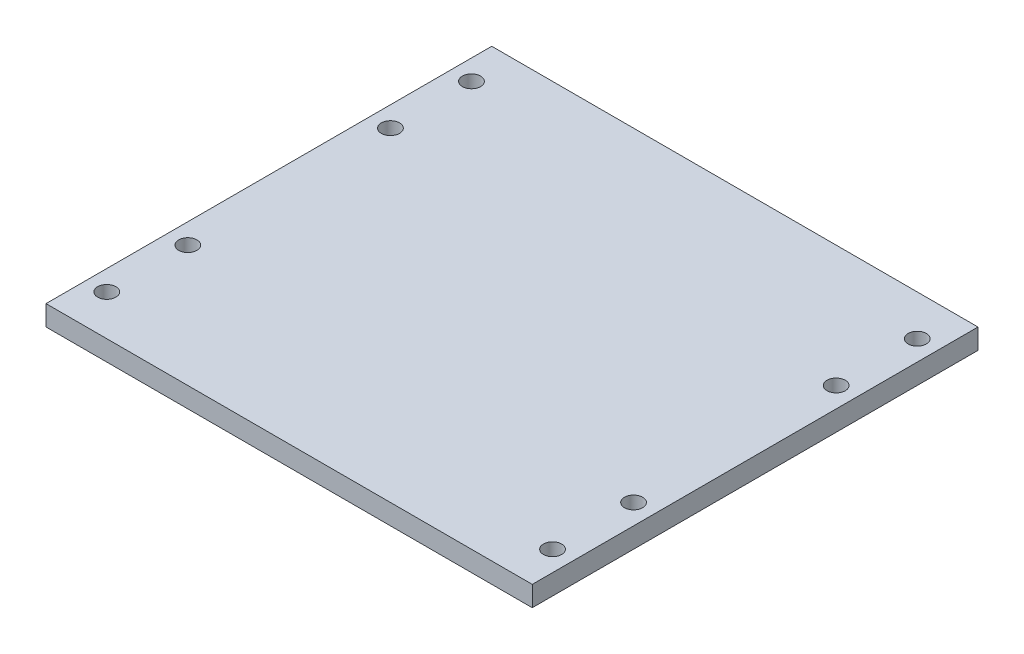
ISO-10303-21;
HEADER;
FILE_DESCRIPTION(('STEP AP214'),'2;1');
FILE_NAME('part.step','',(''),(''),'','','');
FILE_SCHEMA(('AUTOMOTIVE_DESIGN { 1 0 10303 214 1 1 1 1 }'));
ENDSEC;
DATA;
#1=APPLICATION_CONTEXT('core data for automotive mechanical design processes');
#2=APPLICATION_PROTOCOL_DEFINITION('international standard','automotive_design',2000,#1);
#3=PRODUCT_CONTEXT('',#1,'mechanical');
#4=PRODUCT('Part','Part','',(#3));
#5=PRODUCT_RELATED_PRODUCT_CATEGORY('part','',(#4));
#6=PRODUCT_DEFINITION_FORMATION('','',#4);
#7=PRODUCT_DEFINITION_CONTEXT('part definition',#1,'design');
#8=PRODUCT_DEFINITION('design','',#6,#7);
#9=PRODUCT_DEFINITION_SHAPE('','',#8);
#10=(LENGTH_UNIT() NAMED_UNIT(*) SI_UNIT(.MILLI.,.METRE.));
#11=(NAMED_UNIT(*) PLANE_ANGLE_UNIT() SI_UNIT($,.RADIAN.));
#12=(NAMED_UNIT(*) SI_UNIT($,.STERADIAN.) SOLID_ANGLE_UNIT());
#13=UNCERTAINTY_MEASURE_WITH_UNIT(LENGTH_MEASURE(1.E-05),#10,'distance_accuracy_value','');
#14=(GEOMETRIC_REPRESENTATION_CONTEXT(3) GLOBAL_UNCERTAINTY_ASSIGNED_CONTEXT((#13)) GLOBAL_UNIT_ASSIGNED_CONTEXT((#10,
#11,#12)) REPRESENTATION_CONTEXT('',''));
#15=CARTESIAN_POINT('',(0.,0.,0.));
#16=DIRECTION('',(0.,0.,1.));
#17=DIRECTION('',(1.,0.,0.));
#18=AXIS2_PLACEMENT_3D('',#15,#16,#17);
#19=CARTESIAN_POINT('',(-60.,5.,-55.));
#20=DIRECTION('',(1.,0.,0.));
#21=DIRECTION('',(0.,0.,-1.));
#22=AXIS2_PLACEMENT_3D('',#19,#20,#21);
#23=PLANE('',#22);
#24=DIRECTION('',(0.,0.,1.));
#25=VECTOR('',#24,1.);
#26=CARTESIAN_POINT('',(-60.,0.,-55.));
#27=LINE('',#26,#25);
#28=CARTESIAN_POINT('',(-60.,0.,-55.));
#29=VERTEX_POINT('',#28);
#30=CARTESIAN_POINT('',(-60.,0.,55.));
#31=VERTEX_POINT('',#30);
#32=EDGE_CURVE('E122',#29,#31,#27,.T.);
#33=ORIENTED_EDGE('',*,*,#32,.T.);
#34=DIRECTION('',(0.,-1.,0.));
#35=VECTOR('',#34,1.);
#36=CARTESIAN_POINT('',(-60.,5.,55.));
#37=LINE('',#36,#35);
#38=CARTESIAN_POINT('',(-60.,5.,55.));
#39=VERTEX_POINT('',#38);
#40=EDGE_CURVE('E11',#39,#31,#37,.T.);
#41=ORIENTED_EDGE('',*,*,#40,.F.);
#42=DIRECTION('',(0.,0.,1.));
#43=VECTOR('',#42,1.);
#44=CARTESIAN_POINT('',(-60.,5.,-55.));
#45=LINE('',#44,#43);
#46=CARTESIAN_POINT('',(-60.,5.,-55.));
#47=VERTEX_POINT('',#46);
#48=EDGE_CURVE('E103',#47,#39,#45,.T.);
#49=ORIENTED_EDGE('',*,*,#48,.F.);
#50=DIRECTION('',(0.,-1.,0.));
#51=VECTOR('',#50,1.);
#52=CARTESIAN_POINT('',(-60.,5.,-55.));
#53=LINE('',#52,#51);
#54=EDGE_CURVE('E118',#47,#29,#53,.T.);
#55=ORIENTED_EDGE('',*,*,#54,.T.);
#56=EDGE_LOOP('',(#33,#41,#49,#55));
#57=FACE_BOUND('',#56,.T.);
#58=ADVANCED_FACE('F47',(#57),#23,.F.);
#59=CARTESIAN_POINT('',(-60.,5.,55.));
#60=DIRECTION('',(0.,0.,-1.));
#61=DIRECTION('',(-1.,0.,0.));
#62=AXIS2_PLACEMENT_3D('',#59,#60,#61);
#63=PLANE('',#62);
#64=DIRECTION('',(1.,0.,0.));
#65=VECTOR('',#64,1.);
#66=CARTESIAN_POINT('',(-60.,0.,55.));
#67=LINE('',#66,#65);
#68=CARTESIAN_POINT('',(60.,0.,55.));
#69=VERTEX_POINT('',#68);
#70=EDGE_CURVE('E108',#31,#69,#67,.T.);
#71=ORIENTED_EDGE('',*,*,#70,.T.);
#72=DIRECTION('',(0.,-1.,0.));
#73=VECTOR('',#72,1.);
#74=CARTESIAN_POINT('',(60.,5.,55.));
#75=LINE('',#74,#73);
#76=CARTESIAN_POINT('',(60.,5.,55.));
#77=VERTEX_POINT('',#76);
#78=EDGE_CURVE('E56',#77,#69,#75,.T.);
#79=ORIENTED_EDGE('',*,*,#78,.F.);
#80=DIRECTION('',(1.,0.,0.));
#81=VECTOR('',#80,1.);
#82=CARTESIAN_POINT('',(-60.,5.,55.));
#83=LINE('',#82,#81);
#84=EDGE_CURVE('E98',#39,#77,#83,.T.);
#85=ORIENTED_EDGE('',*,*,#84,.F.);
#86=ORIENTED_EDGE('',*,*,#40,.T.);
#87=EDGE_LOOP('',(#71,#79,#85,#86));
#88=FACE_BOUND('',#87,.T.);
#89=ADVANCED_FACE('F107',(#88),#63,.F.);
#90=CARTESIAN_POINT('',(60.,5.,-55.));
#91=DIRECTION('',(-1.,0.,0.));
#92=DIRECTION('',(0.,0.,1.));
#93=AXIS2_PLACEMENT_3D('',#90,#91,#92);
#94=PLANE('',#93);
#95=DIRECTION('',(0.,0.,-1.));
#96=VECTOR('',#95,1.);
#97=CARTESIAN_POINT('',(60.,0.,-55.));
#98=LINE('',#97,#96);
#99=CARTESIAN_POINT('',(60.,0.,-55.));
#100=VERTEX_POINT('',#99);
#101=EDGE_CURVE('E85',#69,#100,#98,.T.);
#102=ORIENTED_EDGE('',*,*,#101,.T.);
#103=DIRECTION('',(0.,-1.,0.));
#104=VECTOR('',#103,1.);
#105=CARTESIAN_POINT('',(60.,5.,-55.));
#106=LINE('',#105,#104);
#107=CARTESIAN_POINT('',(60.,5.,-55.));
#108=VERTEX_POINT('',#107);
#109=EDGE_CURVE('E110',#108,#100,#106,.T.);
#110=ORIENTED_EDGE('',*,*,#109,.F.);
#111=DIRECTION('',(0.,0.,-1.));
#112=VECTOR('',#111,1.);
#113=CARTESIAN_POINT('',(60.,5.,-55.));
#114=LINE('',#113,#112);
#115=EDGE_CURVE('E101',#77,#108,#114,.T.);
#116=ORIENTED_EDGE('',*,*,#115,.F.);
#117=ORIENTED_EDGE('',*,*,#78,.T.);
#118=EDGE_LOOP('',(#102,#110,#116,#117));
#119=FACE_BOUND('',#118,.T.);
#120=ADVANCED_FACE('F111',(#119),#94,.F.);
#121=CARTESIAN_POINT('',(-60.,5.,-55.));
#122=DIRECTION('',(0.,0.,1.));
#123=DIRECTION('',(1.,0.,0.));
#124=AXIS2_PLACEMENT_3D('',#121,#122,#123);
#125=PLANE('',#124);
#126=DIRECTION('',(-1.,0.,0.));
#127=VECTOR('',#126,1.);
#128=CARTESIAN_POINT('',(-60.,0.,-55.));
#129=LINE('',#128,#127);
#130=EDGE_CURVE('E91',#100,#29,#129,.T.);
#131=ORIENTED_EDGE('',*,*,#130,.T.);
#132=ORIENTED_EDGE('',*,*,#54,.F.);
#133=DIRECTION('',(-1.,0.,0.));
#134=VECTOR('',#133,1.);
#135=CARTESIAN_POINT('',(-60.,5.,-55.));
#136=LINE('',#135,#134);
#137=EDGE_CURVE('E67',#108,#47,#136,.T.);
#138=ORIENTED_EDGE('',*,*,#137,.F.);
#139=ORIENTED_EDGE('',*,*,#109,.T.);
#140=EDGE_LOOP('',(#131,#132,#138,#139));
#141=FACE_BOUND('',#140,.T.);
#142=ADVANCED_FACE('F139',(#141),#125,.F.);
#143=CARTESIAN_POINT('',(0.,5.,0.));
#144=DIRECTION('',(0.,1.,0.));
#145=DIRECTION('',(0.,0.,1.));
#146=AXIS2_PLACEMENT_3D('',#143,#144,#145);
#147=PLANE('',#146);
#148=CARTESIAN_POINT('',(-55.,5.,-45.));
#149=DIRECTION('',(0.,1.,0.));
#150=DIRECTION('',(0.,0.,1.));
#151=AXIS2_PLACEMENT_3D('',#148,#149,#150);
#152=CIRCLE('',#151,2.25);
#153=CARTESIAN_POINT('',(-55.,5.,-42.75));
#154=VERTEX_POINT('',#153);
#155=EDGE_CURVE('E203',#154,#154,#152,.T.);
#156=ORIENTED_EDGE('',*,*,#155,.F.);
#157=EDGE_LOOP('',(#156));
#158=FACE_BOUND('',#157,.T.);
#159=CARTESIAN_POINT('',(-55.,5.,-25.));
#160=DIRECTION('',(0.,1.,0.));
#161=DIRECTION('',(0.,0.,1.));
#162=AXIS2_PLACEMENT_3D('',#159,#160,#161);
#163=CIRCLE('',#162,2.25);
#164=CARTESIAN_POINT('',(-55.,5.,-22.75));
#165=VERTEX_POINT('',#164);
#166=EDGE_CURVE('E195',#165,#165,#163,.T.);
#167=ORIENTED_EDGE('',*,*,#166,.F.);
#168=EDGE_LOOP('',(#167));
#169=FACE_BOUND('',#168,.T.);
#170=CARTESIAN_POINT('',(-55.,5.,25.));
#171=DIRECTION('',(0.,1.,0.));
#172=DIRECTION('',(0.,0.,1.));
#173=AXIS2_PLACEMENT_3D('',#170,#171,#172);
#174=CIRCLE('',#173,2.25);
#175=CARTESIAN_POINT('',(-55.,5.,27.25));
#176=VERTEX_POINT('',#175);
#177=EDGE_CURVE('E187',#176,#176,#174,.T.);
#178=ORIENTED_EDGE('',*,*,#177,.F.);
#179=EDGE_LOOP('',(#178));
#180=FACE_BOUND('',#179,.T.);
#181=CARTESIAN_POINT('',(-55.,5.,45.));
#182=DIRECTION('',(0.,1.,0.));
#183=DIRECTION('',(0.,0.,1.));
#184=AXIS2_PLACEMENT_3D('',#181,#182,#183);
#185=CIRCLE('',#184,2.25);
#186=CARTESIAN_POINT('',(-55.,5.,47.25));
#187=VERTEX_POINT('',#186);
#188=EDGE_CURVE('E179',#187,#187,#185,.T.);
#189=ORIENTED_EDGE('',*,*,#188,.F.);
#190=EDGE_LOOP('',(#189));
#191=FACE_BOUND('',#190,.T.);
#192=CARTESIAN_POINT('',(55.,5.,45.));
#193=DIRECTION('',(0.,1.,0.));
#194=DIRECTION('',(0.,0.,1.));
#195=AXIS2_PLACEMENT_3D('',#192,#193,#194);
#196=CIRCLE('',#195,2.25);
#197=CARTESIAN_POINT('',(55.,5.,47.25));
#198=VERTEX_POINT('',#197);
#199=EDGE_CURVE('E171',#198,#198,#196,.T.);
#200=ORIENTED_EDGE('',*,*,#199,.F.);
#201=EDGE_LOOP('',(#200));
#202=FACE_BOUND('',#201,.T.);
#203=CARTESIAN_POINT('',(55.,5.,25.));
#204=DIRECTION('',(0.,1.,0.));
#205=DIRECTION('',(0.,0.,1.));
#206=AXIS2_PLACEMENT_3D('',#203,#204,#205);
#207=CIRCLE('',#206,2.25);
#208=CARTESIAN_POINT('',(55.,5.,27.25));
#209=VERTEX_POINT('',#208);
#210=EDGE_CURVE('E163',#209,#209,#207,.T.);
#211=ORIENTED_EDGE('',*,*,#210,.F.);
#212=EDGE_LOOP('',(#211));
#213=FACE_BOUND('',#212,.T.);
#214=CARTESIAN_POINT('',(55.,5.,-25.));
#215=DIRECTION('',(0.,1.,0.));
#216=DIRECTION('',(0.,0.,1.));
#217=AXIS2_PLACEMENT_3D('',#214,#215,#216);
#218=CIRCLE('',#217,2.25);
#219=CARTESIAN_POINT('',(55.,5.,-22.75));
#220=VERTEX_POINT('',#219);
#221=EDGE_CURVE('E157',#220,#220,#218,.T.);
#222=ORIENTED_EDGE('',*,*,#221,.F.);
#223=EDGE_LOOP('',(#222));
#224=FACE_BOUND('',#223,.T.);
#225=CARTESIAN_POINT('',(55.,5.,-45.));
#226=DIRECTION('',(0.,1.,0.));
#227=DIRECTION('',(0.,0.,1.));
#228=AXIS2_PLACEMENT_3D('',#225,#226,#227);
#229=CIRCLE('',#228,2.25);
#230=CARTESIAN_POINT('',(55.,5.,-42.75));
#231=VERTEX_POINT('',#230);
#232=EDGE_CURVE('E150',#231,#231,#229,.T.);
#233=ORIENTED_EDGE('',*,*,#232,.F.);
#234=EDGE_LOOP('',(#233));
#235=FACE_BOUND('',#234,.T.);
#236=ORIENTED_EDGE('',*,*,#48,.T.);
#237=ORIENTED_EDGE('',*,*,#84,.T.);
#238=ORIENTED_EDGE('',*,*,#115,.T.);
#239=ORIENTED_EDGE('',*,*,#137,.T.);
#240=EDGE_LOOP('',(#236,#237,#238,#239));
#241=FACE_BOUND('',#240,.T.);
#242=ADVANCED_FACE('F99',(#158,#169,#180,#191,#202,#213,#224,#235,#241),#147,.T.);
#243=CARTESIAN_POINT('',(0.,0.,0.));
#244=DIRECTION('',(0.,1.,0.));
#245=DIRECTION('',(0.,0.,1.));
#246=AXIS2_PLACEMENT_3D('',#243,#244,#245);
#247=PLANE('',#246);
#248=CARTESIAN_POINT('',(-55.,0.,-45.));
#249=DIRECTION('',(0.,1.,0.));
#250=DIRECTION('',(0.,0.,1.));
#251=AXIS2_PLACEMENT_3D('',#248,#249,#250);
#252=CIRCLE('',#251,2.25);
#253=CARTESIAN_POINT('',(-55.,0.,-42.75));
#254=VERTEX_POINT('',#253);
#255=EDGE_CURVE('E199',#254,#254,#252,.T.);
#256=ORIENTED_EDGE('',*,*,#255,.T.);
#257=EDGE_LOOP('',(#256));
#258=FACE_BOUND('',#257,.T.);
#259=CARTESIAN_POINT('',(-55.,0.,-25.));
#260=DIRECTION('',(0.,1.,0.));
#261=DIRECTION('',(0.,0.,1.));
#262=AXIS2_PLACEMENT_3D('',#259,#260,#261);
#263=CIRCLE('',#262,2.25);
#264=CARTESIAN_POINT('',(-55.,0.,-22.75));
#265=VERTEX_POINT('',#264);
#266=EDGE_CURVE('E191',#265,#265,#263,.T.);
#267=ORIENTED_EDGE('',*,*,#266,.T.);
#268=EDGE_LOOP('',(#267));
#269=FACE_BOUND('',#268,.T.);
#270=CARTESIAN_POINT('',(-55.,0.,25.));
#271=DIRECTION('',(0.,1.,0.));
#272=DIRECTION('',(0.,0.,1.));
#273=AXIS2_PLACEMENT_3D('',#270,#271,#272);
#274=CIRCLE('',#273,2.25);
#275=CARTESIAN_POINT('',(-55.,0.,27.25));
#276=VERTEX_POINT('',#275);
#277=EDGE_CURVE('E183',#276,#276,#274,.T.);
#278=ORIENTED_EDGE('',*,*,#277,.T.);
#279=EDGE_LOOP('',(#278));
#280=FACE_BOUND('',#279,.T.);
#281=CARTESIAN_POINT('',(-55.,0.,45.));
#282=DIRECTION('',(0.,1.,0.));
#283=DIRECTION('',(0.,0.,1.));
#284=AXIS2_PLACEMENT_3D('',#281,#282,#283);
#285=CIRCLE('',#284,2.25);
#286=CARTESIAN_POINT('',(-55.,0.,47.25));
#287=VERTEX_POINT('',#286);
#288=EDGE_CURVE('E175',#287,#287,#285,.T.);
#289=ORIENTED_EDGE('',*,*,#288,.T.);
#290=EDGE_LOOP('',(#289));
#291=FACE_BOUND('',#290,.T.);
#292=CARTESIAN_POINT('',(55.,0.,45.));
#293=DIRECTION('',(0.,1.,0.));
#294=DIRECTION('',(0.,0.,1.));
#295=AXIS2_PLACEMENT_3D('',#292,#293,#294);
#296=CIRCLE('',#295,2.25);
#297=CARTESIAN_POINT('',(55.,0.,47.25));
#298=VERTEX_POINT('',#297);
#299=EDGE_CURVE('E167',#298,#298,#296,.T.);
#300=ORIENTED_EDGE('',*,*,#299,.T.);
#301=EDGE_LOOP('',(#300));
#302=FACE_BOUND('',#301,.T.);
#303=CARTESIAN_POINT('',(55.,0.,25.));
#304=DIRECTION('',(0.,1.,0.));
#305=DIRECTION('',(0.,0.,1.));
#306=AXIS2_PLACEMENT_3D('',#303,#304,#305);
#307=CIRCLE('',#306,2.25);
#308=CARTESIAN_POINT('',(55.,0.,27.25));
#309=VERTEX_POINT('',#308);
#310=EDGE_CURVE('E160',#309,#309,#307,.T.);
#311=ORIENTED_EDGE('',*,*,#310,.T.);
#312=EDGE_LOOP('',(#311));
#313=FACE_BOUND('',#312,.T.);
#314=CARTESIAN_POINT('',(55.,0.,-25.));
#315=DIRECTION('',(0.,1.,0.));
#316=DIRECTION('',(0.,0.,1.));
#317=AXIS2_PLACEMENT_3D('',#314,#315,#316);
#318=CIRCLE('',#317,2.25);
#319=CARTESIAN_POINT('',(55.,0.,-22.75));
#320=VERTEX_POINT('',#319);
#321=EDGE_CURVE('E153',#320,#320,#318,.T.);
#322=ORIENTED_EDGE('',*,*,#321,.T.);
#323=EDGE_LOOP('',(#322));
#324=FACE_BOUND('',#323,.T.);
#325=CARTESIAN_POINT('',(55.,0.,-45.));
#326=DIRECTION('',(0.,1.,0.));
#327=DIRECTION('',(0.,0.,1.));
#328=AXIS2_PLACEMENT_3D('',#325,#326,#327);
#329=CIRCLE('',#328,2.25);
#330=CARTESIAN_POINT('',(55.,0.,-42.75));
#331=VERTEX_POINT('',#330);
#332=EDGE_CURVE('E126',#331,#331,#329,.T.);
#333=ORIENTED_EDGE('',*,*,#332,.T.);
#334=EDGE_LOOP('',(#333));
#335=FACE_BOUND('',#334,.T.);
#336=ORIENTED_EDGE('',*,*,#32,.F.);
#337=ORIENTED_EDGE('',*,*,#130,.F.);
#338=ORIENTED_EDGE('',*,*,#101,.F.);
#339=ORIENTED_EDGE('',*,*,#70,.F.);
#340=EDGE_LOOP('',(#336,#337,#338,#339));
#341=FACE_BOUND('',#340,.T.);
#342=ADVANCED_FACE('F142',(#258,#269,#280,#291,#302,#313,#324,#335,#341),#247,.F.);
#343=CARTESIAN_POINT('',(55.,5.,-45.));
#344=DIRECTION('',(0.,1.,0.));
#345=DIRECTION('',(0.,0.,1.));
#346=AXIS2_PLACEMENT_3D('',#343,#344,#345);
#347=CYLINDRICAL_SURFACE('',#346,2.25);
#348=ORIENTED_EDGE('',*,*,#332,.F.);
#349=EDGE_LOOP('',(#348));
#350=FACE_BOUND('',#349,.T.);
#351=ORIENTED_EDGE('',*,*,#232,.T.);
#352=EDGE_LOOP('',(#351));
#353=FACE_BOUND('',#352,.T.);
#354=ADVANCED_FACE('F227',(#350,#353),#347,.F.);
#355=CARTESIAN_POINT('',(55.,5.,-25.));
#356=DIRECTION('',(0.,1.,0.));
#357=DIRECTION('',(0.,0.,1.));
#358=AXIS2_PLACEMENT_3D('',#355,#356,#357);
#359=CYLINDRICAL_SURFACE('',#358,2.25);
#360=ORIENTED_EDGE('',*,*,#321,.F.);
#361=EDGE_LOOP('',(#360));
#362=FACE_BOUND('',#361,.T.);
#363=ORIENTED_EDGE('',*,*,#221,.T.);
#364=EDGE_LOOP('',(#363));
#365=FACE_BOUND('',#364,.T.);
#366=ADVANCED_FACE('F229',(#362,#365),#359,.F.);
#367=CARTESIAN_POINT('',(55.,5.,25.));
#368=DIRECTION('',(0.,1.,0.));
#369=DIRECTION('',(0.,0.,1.));
#370=AXIS2_PLACEMENT_3D('',#367,#368,#369);
#371=CYLINDRICAL_SURFACE('',#370,2.25);
#372=ORIENTED_EDGE('',*,*,#310,.F.);
#373=EDGE_LOOP('',(#372));
#374=FACE_BOUND('',#373,.T.);
#375=ORIENTED_EDGE('',*,*,#210,.T.);
#376=EDGE_LOOP('',(#375));
#377=FACE_BOUND('',#376,.T.);
#378=ADVANCED_FACE('F236',(#374,#377),#371,.F.);
#379=CARTESIAN_POINT('',(55.,5.,45.));
#380=DIRECTION('',(0.,1.,0.));
#381=DIRECTION('',(0.,0.,1.));
#382=AXIS2_PLACEMENT_3D('',#379,#380,#381);
#383=CYLINDRICAL_SURFACE('',#382,2.25);
#384=ORIENTED_EDGE('',*,*,#299,.F.);
#385=EDGE_LOOP('',(#384));
#386=FACE_BOUND('',#385,.T.);
#387=ORIENTED_EDGE('',*,*,#199,.T.);
#388=EDGE_LOOP('',(#387));
#389=FACE_BOUND('',#388,.T.);
#390=ADVANCED_FACE('F288',(#386,#389),#383,.F.);
#391=CARTESIAN_POINT('',(-55.,5.,45.));
#392=DIRECTION('',(0.,1.,0.));
#393=DIRECTION('',(0.,0.,1.));
#394=AXIS2_PLACEMENT_3D('',#391,#392,#393);
#395=CYLINDRICAL_SURFACE('',#394,2.25);
#396=ORIENTED_EDGE('',*,*,#288,.F.);
#397=EDGE_LOOP('',(#396));
#398=FACE_BOUND('',#397,.T.);
#399=ORIENTED_EDGE('',*,*,#188,.T.);
#400=EDGE_LOOP('',(#399));
#401=FACE_BOUND('',#400,.T.);
#402=ADVANCED_FACE('F298',(#398,#401),#395,.F.);
#403=CARTESIAN_POINT('',(-55.,5.,25.));
#404=DIRECTION('',(0.,1.,0.));
#405=DIRECTION('',(0.,0.,1.));
#406=AXIS2_PLACEMENT_3D('',#403,#404,#405);
#407=CYLINDRICAL_SURFACE('',#406,2.25);
#408=ORIENTED_EDGE('',*,*,#277,.F.);
#409=EDGE_LOOP('',(#408));
#410=FACE_BOUND('',#409,.T.);
#411=ORIENTED_EDGE('',*,*,#177,.T.);
#412=EDGE_LOOP('',(#411));
#413=FACE_BOUND('',#412,.T.);
#414=ADVANCED_FACE('F308',(#410,#413),#407,.F.);
#415=CARTESIAN_POINT('',(-55.,5.,-25.));
#416=DIRECTION('',(0.,1.,0.));
#417=DIRECTION('',(0.,0.,1.));
#418=AXIS2_PLACEMENT_3D('',#415,#416,#417);
#419=CYLINDRICAL_SURFACE('',#418,2.25);
#420=ORIENTED_EDGE('',*,*,#266,.F.);
#421=EDGE_LOOP('',(#420));
#422=FACE_BOUND('',#421,.T.);
#423=ORIENTED_EDGE('',*,*,#166,.T.);
#424=EDGE_LOOP('',(#423));
#425=FACE_BOUND('',#424,.T.);
#426=ADVANCED_FACE('F318',(#422,#425),#419,.F.);
#427=CARTESIAN_POINT('',(-55.,5.,-45.));
#428=DIRECTION('',(0.,1.,0.));
#429=DIRECTION('',(0.,0.,1.));
#430=AXIS2_PLACEMENT_3D('',#427,#428,#429);
#431=CYLINDRICAL_SURFACE('',#430,2.25);
#432=ORIENTED_EDGE('',*,*,#255,.F.);
#433=EDGE_LOOP('',(#432));
#434=FACE_BOUND('',#433,.T.);
#435=ORIENTED_EDGE('',*,*,#155,.T.);
#436=EDGE_LOOP('',(#435));
#437=FACE_BOUND('',#436,.T.);
#438=ADVANCED_FACE('F208',(#434,#437),#431,.F.);
#439=CLOSED_SHELL('',(#58,#89,#120,#142,#242,#342,#354,#366,#378,#390,#402,#414,#426,#438));
#440=MANIFOLD_SOLID_BREP('B2',#439);
#441=ADVANCED_BREP_SHAPE_REPRESENTATION('',(#18,#440),#14);
#442=SHAPE_DEFINITION_REPRESENTATION(#9,#441);
ENDSEC;
END-ISO-10303-21;
